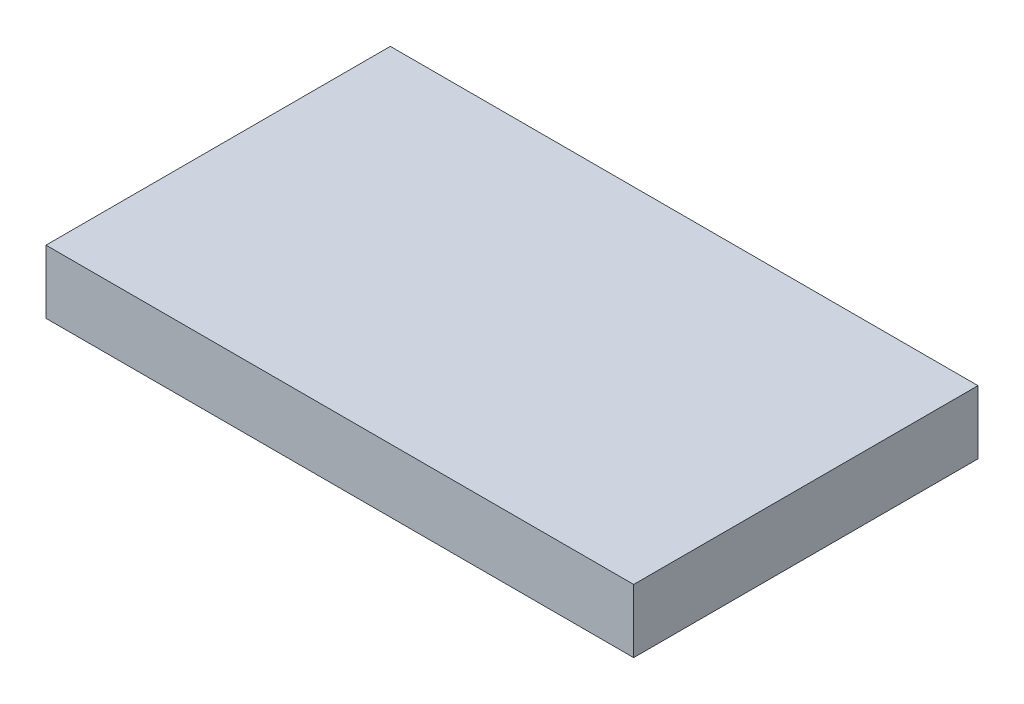
ISO-10303-21;
HEADER;
FILE_DESCRIPTION(('STEP AP214'),'2;1');
FILE_NAME('part.step','',(''),(''),'','','');
FILE_SCHEMA(('AUTOMOTIVE_DESIGN { 1 0 10303 214 1 1 1 1 }'));
ENDSEC;
DATA;
#1=APPLICATION_CONTEXT('core data for automotive mechanical design processes');
#2=APPLICATION_PROTOCOL_DEFINITION('international standard','automotive_design',2000,#1);
#3=PRODUCT_CONTEXT('',#1,'mechanical');
#4=PRODUCT('Part','Part','',(#3));
#5=PRODUCT_RELATED_PRODUCT_CATEGORY('part','',(#4));
#6=PRODUCT_DEFINITION_FORMATION('','',#4);
#7=PRODUCT_DEFINITION_CONTEXT('part definition',#1,'design');
#8=PRODUCT_DEFINITION('design','',#6,#7);
#9=PRODUCT_DEFINITION_SHAPE('','',#8);
#10=(LENGTH_UNIT() NAMED_UNIT(*) SI_UNIT(.MILLI.,.METRE.));
#11=(NAMED_UNIT(*) PLANE_ANGLE_UNIT() SI_UNIT($,.RADIAN.));
#12=(NAMED_UNIT(*) SI_UNIT($,.STERADIAN.) SOLID_ANGLE_UNIT());
#13=UNCERTAINTY_MEASURE_WITH_UNIT(LENGTH_MEASURE(1.E-05),#10,'distance_accuracy_value','');
#14=(GEOMETRIC_REPRESENTATION_CONTEXT(3) GLOBAL_UNCERTAINTY_ASSIGNED_CONTEXT((#13)) GLOBAL_UNIT_ASSIGNED_CONTEXT((#10,
#11,#12)) REPRESENTATION_CONTEXT('',''));
#15=CARTESIAN_POINT('',(0.,0.,0.));
#16=DIRECTION('',(0.,0.,1.));
#17=DIRECTION('',(1.,0.,0.));
#18=AXIS2_PLACEMENT_3D('',#15,#16,#17);
#19=CARTESIAN_POINT('',(29.424999999999,6.34999999999999,-17.24));
#20=DIRECTION('',(-1.,0.,0.));
#21=DIRECTION('',(0.,0.,1.));
#22=AXIS2_PLACEMENT_3D('',#19,#20,#21);
#23=PLANE('',#22);
#24=DIRECTION('',(0.,0.,-1.));
#25=VECTOR('',#24,1.);
#26=CARTESIAN_POINT('',(29.425,0.,-17.24));
#27=LINE('',#26,#25);
#28=CARTESIAN_POINT('',(29.425,0.,17.24));
#29=VERTEX_POINT('',#28);
#30=CARTESIAN_POINT('',(29.425,0.,-17.24));
#31=VERTEX_POINT('',#30);
#32=EDGE_CURVE('E95',#29,#31,#27,.T.);
#33=ORIENTED_EDGE('',*,*,#32,.T.);
#34=DIRECTION('',(0.,-1.,0.));
#35=VECTOR('',#34,1.);
#36=CARTESIAN_POINT('',(29.424999999999,6.34999999999999,-17.24));
#37=LINE('',#36,#35);
#38=CARTESIAN_POINT('',(29.424999999999,6.34999999999999,-17.24));
#39=VERTEX_POINT('',#38);
#40=EDGE_CURVE('E11',#39,#31,#37,.T.);
#41=ORIENTED_EDGE('',*,*,#40,.F.);
#42=DIRECTION('',(0.,0.,-1.));
#43=VECTOR('',#42,1.);
#44=CARTESIAN_POINT('',(29.424999999999,6.34999999999999,-17.24));
#45=LINE('',#44,#43);
#46=CARTESIAN_POINT('',(29.424999999999,6.34999999999988,17.2400000000001));
#47=VERTEX_POINT('',#46);
#48=EDGE_CURVE('E83',#47,#39,#45,.T.);
#49=ORIENTED_EDGE('',*,*,#48,.F.);
#50=DIRECTION('',(0.,-1.,0.));
#51=VECTOR('',#50,1.);
#52=CARTESIAN_POINT('',(29.424999999999,6.34999999999988,17.2400000000001));
#53=LINE('',#52,#51);
#54=EDGE_CURVE('E91',#47,#29,#53,.T.);
#55=ORIENTED_EDGE('',*,*,#54,.T.);
#56=EDGE_LOOP('',(#33,#41,#49,#55));
#57=FACE_BOUND('',#56,.T.);
#58=ADVANCED_FACE('F32',(#57),#23,.F.);
#59=CARTESIAN_POINT('',(-29.425000000001,6.34999999999997,-17.24));
#60=DIRECTION('',(0.,0.,1.));
#61=DIRECTION('',(1.,0.,0.));
#62=AXIS2_PLACEMENT_3D('',#59,#60,#61);
#63=PLANE('',#62);
#64=DIRECTION('',(-1.,0.,0.));
#65=VECTOR('',#64,1.);
#66=CARTESIAN_POINT('',(-29.425,0.,-17.24));
#67=LINE('',#66,#65);
#68=CARTESIAN_POINT('',(-29.425,0.,-17.24));
#69=VERTEX_POINT('',#68);
#70=EDGE_CURVE('E87',#31,#69,#67,.T.);
#71=ORIENTED_EDGE('',*,*,#70,.T.);
#72=DIRECTION('',(0.,-1.,0.));
#73=VECTOR('',#72,1.);
#74=CARTESIAN_POINT('',(-29.425000000001,6.34999999999997,-17.24));
#75=LINE('',#74,#73);
#76=CARTESIAN_POINT('',(-29.425000000001,6.34999999999997,-17.24));
#77=VERTEX_POINT('',#76);
#78=EDGE_CURVE('E40',#77,#69,#75,.T.);
#79=ORIENTED_EDGE('',*,*,#78,.F.);
#80=DIRECTION('',(-1.,0.,0.));
#81=VECTOR('',#80,1.);
#82=CARTESIAN_POINT('',(-29.425000000001,6.34999999999997,-17.24));
#83=LINE('',#82,#81);
#84=EDGE_CURVE('E78',#39,#77,#83,.T.);
#85=ORIENTED_EDGE('',*,*,#84,.F.);
#86=ORIENTED_EDGE('',*,*,#40,.T.);
#87=EDGE_LOOP('',(#71,#79,#85,#86));
#88=FACE_BOUND('',#87,.T.);
#89=ADVANCED_FACE('F86',(#88),#63,.F.);
#90=CARTESIAN_POINT('',(-29.425000000001,6.34999999999997,-17.24));
#91=DIRECTION('',(1.,0.,0.));
#92=DIRECTION('',(0.,0.,-1.));
#93=AXIS2_PLACEMENT_3D('',#90,#91,#92);
#94=PLANE('',#93);
#95=DIRECTION('',(0.,0.,1.));
#96=VECTOR('',#95,1.);
#97=CARTESIAN_POINT('',(-29.425,0.,-17.24));
#98=LINE('',#97,#96);
#99=CARTESIAN_POINT('',(-29.425,0.,17.24));
#100=VERTEX_POINT('',#99);
#101=EDGE_CURVE('E65',#69,#100,#98,.T.);
#102=ORIENTED_EDGE('',*,*,#101,.T.);
#103=DIRECTION('',(0.,-1.,0.));
#104=VECTOR('',#103,1.);
#105=CARTESIAN_POINT('',(-29.425000000001,6.34999999999999,17.2400000000001));
#106=LINE('',#105,#104);
#107=CARTESIAN_POINT('',(-29.425000000001,6.34999999999999,17.2400000000001));
#108=VERTEX_POINT('',#107);
#109=EDGE_CURVE('E88',#108,#100,#106,.T.);
#110=ORIENTED_EDGE('',*,*,#109,.F.);
#111=DIRECTION('',(0.,0.,1.));
#112=VECTOR('',#111,1.);
#113=CARTESIAN_POINT('',(-29.425000000001,6.34999999999997,-17.24));
#114=LINE('',#113,#112);
#115=EDGE_CURVE('E81',#77,#108,#114,.T.);
#116=ORIENTED_EDGE('',*,*,#115,.F.);
#117=ORIENTED_EDGE('',*,*,#78,.T.);
#118=EDGE_LOOP('',(#102,#110,#116,#117));
#119=FACE_BOUND('',#118,.T.);
#120=ADVANCED_FACE('F89',(#119),#94,.F.);
#121=CARTESIAN_POINT('',(-29.425000000001,6.34999999999999,17.2400000000001));
#122=DIRECTION('',(0.,0.,-1.));
#123=DIRECTION('',(-1.,0.,0.));
#124=AXIS2_PLACEMENT_3D('',#121,#122,#123);
#125=PLANE('',#124);
#126=DIRECTION('',(1.,0.,0.));
#127=VECTOR('',#126,1.);
#128=CARTESIAN_POINT('',(-29.425,0.,17.24));
#129=LINE('',#128,#127);
#130=EDGE_CURVE('E71',#100,#29,#129,.T.);
#131=ORIENTED_EDGE('',*,*,#130,.T.);
#132=ORIENTED_EDGE('',*,*,#54,.F.);
#133=DIRECTION('',(1.,0.,0.));
#134=VECTOR('',#133,1.);
#135=CARTESIAN_POINT('',(-29.425000000001,6.34999999999999,17.2400000000001));
#136=LINE('',#135,#134);
#137=EDGE_CURVE('E48',#108,#47,#136,.T.);
#138=ORIENTED_EDGE('',*,*,#137,.F.);
#139=ORIENTED_EDGE('',*,*,#109,.T.);
#140=EDGE_LOOP('',(#131,#132,#138,#139));
#141=FACE_BOUND('',#140,.T.);
#142=ADVANCED_FACE('F102',(#141),#125,.F.);
#143=CARTESIAN_POINT('',(-1.00267016911459E-12,6.34999999999999,0.));
#144=DIRECTION('',(0.,1.,0.));
#145=DIRECTION('',(0.,0.,1.));
#146=AXIS2_PLACEMENT_3D('',#143,#144,#145);
#147=PLANE('',#146);
#148=ORIENTED_EDGE('',*,*,#48,.T.);
#149=ORIENTED_EDGE('',*,*,#84,.T.);
#150=ORIENTED_EDGE('',*,*,#115,.T.);
#151=ORIENTED_EDGE('',*,*,#137,.T.);
#152=EDGE_LOOP('',(#148,#149,#150,#151));
#153=FACE_BOUND('',#152,.T.);
#154=ADVANCED_FACE('F79',(#153),#147,.T.);
#155=CARTESIAN_POINT('',(0.,0.,0.));
#156=DIRECTION('',(0.,1.,0.));
#157=DIRECTION('',(0.,0.,1.));
#158=AXIS2_PLACEMENT_3D('',#155,#156,#157);
#159=PLANE('',#158);
#160=ORIENTED_EDGE('',*,*,#32,.F.);
#161=ORIENTED_EDGE('',*,*,#130,.F.);
#162=ORIENTED_EDGE('',*,*,#101,.F.);
#163=ORIENTED_EDGE('',*,*,#70,.F.);
#164=EDGE_LOOP('',(#160,#161,#162,#163));
#165=FACE_BOUND('',#164,.T.);
#166=ADVANCED_FACE('F105',(#165),#159,.F.);
#167=CLOSED_SHELL('',(#58,#89,#120,#142,#154,#166));
#168=MANIFOLD_SOLID_BREP('B2',#167);
#169=ADVANCED_BREP_SHAPE_REPRESENTATION('',(#18,#168),#14);
#170=SHAPE_DEFINITION_REPRESENTATION(#9,#169);
ENDSEC;
END-ISO-10303-21;
